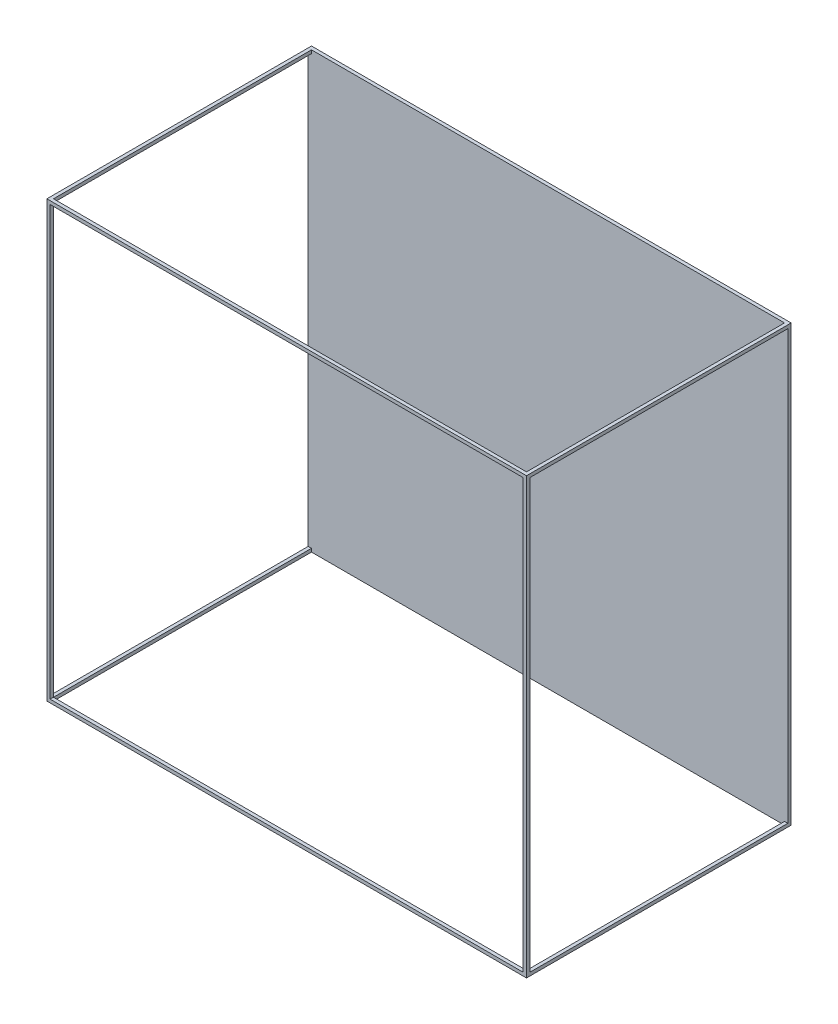
ISO-10303-21;
HEADER;
FILE_DESCRIPTION(('STEP AP214'),'2;1');
FILE_NAME('part.step','',(''),(''),'','','');
FILE_SCHEMA(('AUTOMOTIVE_DESIGN { 1 0 10303 214 1 1 1 1 }'));
ENDSEC;
DATA;
#1=APPLICATION_CONTEXT('core data for automotive mechanical design processes');
#2=APPLICATION_PROTOCOL_DEFINITION('international standard','automotive_design',2000,#1);
#3=PRODUCT_CONTEXT('',#1,'mechanical');
#4=PRODUCT('Part','Part','',(#3));
#5=PRODUCT_RELATED_PRODUCT_CATEGORY('part','',(#4));
#6=PRODUCT_DEFINITION_FORMATION('','',#4);
#7=PRODUCT_DEFINITION_CONTEXT('part definition',#1,'design');
#8=PRODUCT_DEFINITION('design','',#6,#7);
#9=PRODUCT_DEFINITION_SHAPE('','',#8);
#10=(LENGTH_UNIT() NAMED_UNIT(*) SI_UNIT(.MILLI.,.METRE.));
#11=(NAMED_UNIT(*) PLANE_ANGLE_UNIT() SI_UNIT($,.RADIAN.));
#12=(NAMED_UNIT(*) SI_UNIT($,.STERADIAN.) SOLID_ANGLE_UNIT());
#13=UNCERTAINTY_MEASURE_WITH_UNIT(LENGTH_MEASURE(1.E-05),#10,'distance_accuracy_value','');
#14=(GEOMETRIC_REPRESENTATION_CONTEXT(3) GLOBAL_UNCERTAINTY_ASSIGNED_CONTEXT((#13)) GLOBAL_UNIT_ASSIGNED_CONTEXT((#10,
#11,#12)) REPRESENTATION_CONTEXT('',''));
#15=CARTESIAN_POINT('',(0.,0.,0.));
#16=DIRECTION('',(0.,0.,1.));
#17=DIRECTION('',(1.,0.,0.));
#18=AXIS2_PLACEMENT_3D('',#15,#16,#17);
#19=CARTESIAN_POINT('',(-71.5,65.75,40.));
#20=DIRECTION('',(1.,0.,0.));
#21=DIRECTION('',(0.,1.,0.));
#22=AXIS2_PLACEMENT_3D('',#19,#20,#21);
#23=PLANE('',#22);
#24=DIRECTION('',(0.,0.,1.));
#25=VECTOR('',#24,1.);
#26=CARTESIAN_POINT('',(-71.5,64.75,40.));
#27=LINE('',#26,#25);
#28=CARTESIAN_POINT('',(-71.5,64.75,-39.));
#29=VERTEX_POINT('',#28);
#30=CARTESIAN_POINT('',(-71.5,64.75,39.));
#31=VERTEX_POINT('',#30);
#32=EDGE_CURVE('E202',#29,#31,#27,.T.);
#33=ORIENTED_EDGE('',*,*,#32,.F.);
#34=DIRECTION('',(0.,-1.,0.));
#35=VECTOR('',#34,1.);
#36=CARTESIAN_POINT('',(-71.5,65.75,-39.));
#37=LINE('',#36,#35);
#38=CARTESIAN_POINT('',(-71.5,65.75,-39.));
#39=VERTEX_POINT('',#38);
#40=EDGE_CURVE('E252',#39,#29,#37,.T.);
#41=ORIENTED_EDGE('',*,*,#40,.F.);
#42=DIRECTION('',(0.,0.,1.));
#43=VECTOR('',#42,1.);
#44=CARTESIAN_POINT('',(-71.5,65.75,-39.));
#45=LINE('',#44,#43);
#46=CARTESIAN_POINT('',(-71.5,65.75,39.));
#47=VERTEX_POINT('',#46);
#48=EDGE_CURVE('E218',#39,#47,#45,.T.);
#49=ORIENTED_EDGE('',*,*,#48,.T.);
#50=DIRECTION('',(0.,1.,0.));
#51=VECTOR('',#50,1.);
#52=CARTESIAN_POINT('',(-71.5,-94.25,39.));
#53=LINE('',#52,#51);
#54=EDGE_CURVE('E229',#31,#47,#53,.T.);
#55=ORIENTED_EDGE('',*,*,#54,.F.);
#56=EDGE_LOOP('',(#33,#41,#49,#55));
#57=FACE_BOUND('',#56,.T.);
#58=ADVANCED_FACE('F33',(#57),#23,.T.);
#59=DIRECTION('',(0.,-1.,0.));
#60=VECTOR('',#59,1.);
#61=CARTESIAN_POINT('',(-71.5,65.75,39.));
#62=LINE('',#61,#60);
#63=CARTESIAN_POINT('',(-71.5,-64.75,39.));
#64=VERTEX_POINT('',#63);
#65=EDGE_CURVE('E209',#31,#64,#62,.T.);
#66=ORIENTED_EDGE('',*,*,#65,.F.);
#67=DIRECTION('',(0.,0.,-1.));
#68=VECTOR('',#67,1.);
#69=CARTESIAN_POINT('',(-71.5,64.75,40.));
#70=LINE('',#69,#68);
#71=CARTESIAN_POINT('',(-71.5,64.75,40.));
#72=VERTEX_POINT('',#71);
#73=EDGE_CURVE('E261',#72,#31,#70,.T.);
#74=ORIENTED_EDGE('',*,*,#73,.F.);
#75=DIRECTION('',(0.,-1.,0.));
#76=VECTOR('',#75,1.);
#77=CARTESIAN_POINT('',(-71.5,65.75,40.));
#78=LINE('',#77,#76);
#79=CARTESIAN_POINT('',(-71.5,-64.75,40.));
#80=VERTEX_POINT('',#79);
#81=EDGE_CURVE('E269',#72,#80,#78,.T.);
#82=ORIENTED_EDGE('',*,*,#81,.T.);
#83=DIRECTION('',(0.,0.,-1.));
#84=VECTOR('',#83,1.);
#85=CARTESIAN_POINT('',(-71.5,-64.75,40.));
#86=LINE('',#85,#84);
#87=EDGE_CURVE('E256',#80,#64,#86,.T.);
#88=ORIENTED_EDGE('',*,*,#87,.T.);
#89=EDGE_LOOP('',(#66,#74,#82,#88));
#90=FACE_BOUND('',#89,.T.);
#91=ADVANCED_FACE('F338',(#90),#23,.T.);
#92=CARTESIAN_POINT('',(71.5,65.75,40.));
#93=DIRECTION('',(-1.,0.,0.));
#94=DIRECTION('',(0.,0.,1.));
#95=AXIS2_PLACEMENT_3D('',#92,#93,#94);
#96=PLANE('',#95);
#97=DIRECTION('',(0.,0.,-1.));
#98=VECTOR('',#97,1.);
#99=CARTESIAN_POINT('',(71.5,64.75,40.));
#100=LINE('',#99,#98);
#101=CARTESIAN_POINT('',(71.4999999999999,64.75,39.));
#102=VERTEX_POINT('',#101);
#103=CARTESIAN_POINT('',(71.5,64.75,-39.));
#104=VERTEX_POINT('',#103);
#105=EDGE_CURVE('E200',#102,#104,#100,.T.);
#106=ORIENTED_EDGE('',*,*,#105,.F.);
#107=DIRECTION('',(0.,1.,0.));
#108=VECTOR('',#107,1.);
#109=CARTESIAN_POINT('',(71.5,-94.25,39.));
#110=LINE('',#109,#108);
#111=CARTESIAN_POINT('',(71.5,65.75,39.));
#112=VERTEX_POINT('',#111);
#113=EDGE_CURVE('E230',#102,#112,#110,.T.);
#114=ORIENTED_EDGE('',*,*,#113,.T.);
#115=DIRECTION('',(0.,0.,-1.));
#116=VECTOR('',#115,1.);
#117=CARTESIAN_POINT('',(71.5,65.75,-39.));
#118=LINE('',#117,#116);
#119=CARTESIAN_POINT('',(71.5,65.75,-39.));
#120=VERTEX_POINT('',#119);
#121=EDGE_CURVE('E223',#112,#120,#118,.T.);
#122=ORIENTED_EDGE('',*,*,#121,.T.);
#123=DIRECTION('',(0.,1.,0.));
#124=VECTOR('',#123,1.);
#125=CARTESIAN_POINT('',(71.5,65.75,-39.));
#126=LINE('',#125,#124);
#127=EDGE_CURVE('E255',#104,#120,#126,.T.);
#128=ORIENTED_EDGE('',*,*,#127,.F.);
#129=EDGE_LOOP('',(#106,#114,#122,#128));
#130=FACE_BOUND('',#129,.T.);
#131=ADVANCED_FACE('F344',(#130),#96,.T.);
#132=DIRECTION('',(0.,1.,0.));
#133=VECTOR('',#132,1.);
#134=CARTESIAN_POINT('',(71.5,65.75,39.));
#135=LINE('',#134,#133);
#136=CARTESIAN_POINT('',(71.4999999999999,-64.75,39.));
#137=VERTEX_POINT('',#136);
#138=EDGE_CURVE('E207',#137,#102,#135,.T.);
#139=ORIENTED_EDGE('',*,*,#138,.F.);
#140=DIRECTION('',(0.,0.,-1.));
#141=VECTOR('',#140,1.);
#142=CARTESIAN_POINT('',(71.5,-64.75,40.));
#143=LINE('',#142,#141);
#144=CARTESIAN_POINT('',(71.5,-64.75,40.));
#145=VERTEX_POINT('',#144);
#146=EDGE_CURVE('E260',#145,#137,#143,.T.);
#147=ORIENTED_EDGE('',*,*,#146,.F.);
#148=DIRECTION('',(0.,1.,0.));
#149=VECTOR('',#148,1.);
#150=CARTESIAN_POINT('',(71.5,65.75,40.));
#151=LINE('',#150,#149);
#152=CARTESIAN_POINT('',(71.5,64.75,40.));
#153=VERTEX_POINT('',#152);
#154=EDGE_CURVE('E275',#145,#153,#151,.T.);
#155=ORIENTED_EDGE('',*,*,#154,.T.);
#156=DIRECTION('',(0.,0.,-1.));
#157=VECTOR('',#156,1.);
#158=CARTESIAN_POINT('',(71.5,64.75,40.));
#159=LINE('',#158,#157);
#160=EDGE_CURVE('E264',#153,#102,#159,.T.);
#161=ORIENTED_EDGE('',*,*,#160,.T.);
#162=EDGE_LOOP('',(#139,#147,#155,#161));
#163=FACE_BOUND('',#162,.T.);
#164=ADVANCED_FACE('F375',(#163),#96,.T.);
#165=CARTESIAN_POINT('',(-72.5,65.75,40.));
#166=DIRECTION('',(1.,0.,0.));
#167=DIRECTION('',(0.,1.,0.));
#168=AXIS2_PLACEMENT_3D('',#165,#166,#167);
#169=PLANE('',#168);
#170=DIRECTION('',(0.,0.,1.));
#171=VECTOR('',#170,1.);
#172=CARTESIAN_POINT('',(-72.5,64.75,40.));
#173=LINE('',#172,#171);
#174=CARTESIAN_POINT('',(-72.5,64.75,-39.));
#175=VERTEX_POINT('',#174);
#176=CARTESIAN_POINT('',(-72.5,64.75,39.));
#177=VERTEX_POINT('',#176);
#178=EDGE_CURVE('E204',#175,#177,#173,.T.);
#179=ORIENTED_EDGE('',*,*,#178,.T.);
#180=DIRECTION('',(0.,-1.,0.));
#181=VECTOR('',#180,1.);
#182=CARTESIAN_POINT('',(-72.5,65.75,39.));
#183=LINE('',#182,#181);
#184=CARTESIAN_POINT('',(-72.5,-64.75,39.));
#185=VERTEX_POINT('',#184);
#186=EDGE_CURVE('E212',#177,#185,#183,.T.);
#187=ORIENTED_EDGE('',*,*,#186,.T.);
#188=DIRECTION('',(0.,0.,-1.));
#189=VECTOR('',#188,1.);
#190=CARTESIAN_POINT('',(-72.5,-64.75,40.));
#191=LINE('',#190,#189);
#192=CARTESIAN_POINT('',(-72.5,-64.75,-39.));
#193=VERTEX_POINT('',#192);
#194=EDGE_CURVE('E197',#185,#193,#191,.T.);
#195=ORIENTED_EDGE('',*,*,#194,.T.);
#196=DIRECTION('',(0.,1.,0.));
#197=VECTOR('',#196,1.);
#198=CARTESIAN_POINT('',(-72.5,65.75,-39.));
#199=LINE('',#198,#197);
#200=EDGE_CURVE('E215',#193,#175,#199,.T.);
#201=ORIENTED_EDGE('',*,*,#200,.T.);
#202=EDGE_LOOP('',(#179,#187,#195,#201));
#203=FACE_BOUND('',#202,.T.);
#204=DIRECTION('',(0.,-1.,0.));
#205=VECTOR('',#204,1.);
#206=CARTESIAN_POINT('',(-72.5,65.75,-40.));
#207=LINE('',#206,#205);
#208=CARTESIAN_POINT('',(-72.5,65.75,-40.));
#209=VERTEX_POINT('',#208);
#210=CARTESIAN_POINT('',(-72.5,-65.75,-40.));
#211=VERTEX_POINT('',#210);
#212=EDGE_CURVE('E259',#209,#211,#207,.T.);
#213=ORIENTED_EDGE('',*,*,#212,.T.);
#214=DIRECTION('',(0.,0.,-1.));
#215=VECTOR('',#214,1.);
#216=CARTESIAN_POINT('',(-72.5,-65.75,40.));
#217=LINE('',#216,#215);
#218=CARTESIAN_POINT('',(-72.5,-65.75,40.));
#219=VERTEX_POINT('',#218);
#220=EDGE_CURVE('E41',#219,#211,#217,.T.);
#221=ORIENTED_EDGE('',*,*,#220,.F.);
#222=DIRECTION('',(0.,-1.,0.));
#223=VECTOR('',#222,1.);
#224=CARTESIAN_POINT('',(-72.5,65.75,40.));
#225=LINE('',#224,#223);
#226=CARTESIAN_POINT('',(-72.5,65.75,40.));
#227=VERTEX_POINT('',#226);
#228=EDGE_CURVE('E279',#227,#219,#225,.T.);
#229=ORIENTED_EDGE('',*,*,#228,.F.);
#230=DIRECTION('',(0.,0.,-1.));
#231=VECTOR('',#230,1.);
#232=CARTESIAN_POINT('',(-72.5,65.75,40.));
#233=LINE('',#232,#231);
#234=EDGE_CURVE('E289',#227,#209,#233,.T.);
#235=ORIENTED_EDGE('',*,*,#234,.T.);
#236=EDGE_LOOP('',(#213,#221,#229,#235));
#237=FACE_BOUND('',#236,.T.);
#238=ADVANCED_FACE('F35',(#203,#237),#169,.F.);
#239=CARTESIAN_POINT('',(-72.5,-65.75,40.));
#240=DIRECTION('',(0.,1.,0.));
#241=DIRECTION('',(-1.,0.,0.));
#242=AXIS2_PLACEMENT_3D('',#239,#240,#241);
#243=PLANE('',#242);
#244=DIRECTION('',(-1.,0.,0.));
#245=VECTOR('',#244,1.);
#246=CARTESIAN_POINT('',(-72.5,-65.75,-39.));
#247=LINE('',#246,#245);
#248=CARTESIAN_POINT('',(71.5,-65.75,-39.));
#249=VERTEX_POINT('',#248);
#250=CARTESIAN_POINT('',(-71.5,-65.75,-39.));
#251=VERTEX_POINT('',#250);
#252=EDGE_CURVE('E248',#249,#251,#247,.T.);
#253=ORIENTED_EDGE('',*,*,#252,.T.);
#254=DIRECTION('',(0.,0.,1.));
#255=VECTOR('',#254,1.);
#256=CARTESIAN_POINT('',(-71.5,-65.75,40.));
#257=LINE('',#256,#255);
#258=CARTESIAN_POINT('',(-71.5,-65.75,39.));
#259=VERTEX_POINT('',#258);
#260=EDGE_CURVE('E239',#251,#259,#257,.T.);
#261=ORIENTED_EDGE('',*,*,#260,.T.);
#262=DIRECTION('',(1.,0.,0.));
#263=VECTOR('',#262,1.);
#264=CARTESIAN_POINT('',(-72.5,-65.75,39.));
#265=LINE('',#264,#263);
#266=CARTESIAN_POINT('',(71.5,-65.75,39.));
#267=VERTEX_POINT('',#266);
#268=EDGE_CURVE('E245',#259,#267,#265,.T.);
#269=ORIENTED_EDGE('',*,*,#268,.T.);
#270=DIRECTION('',(0.,0.,-1.));
#271=VECTOR('',#270,1.);
#272=CARTESIAN_POINT('',(71.5,-65.75,40.));
#273=LINE('',#272,#271);
#274=EDGE_CURVE('E236',#267,#249,#273,.T.);
#275=ORIENTED_EDGE('',*,*,#274,.T.);
#276=EDGE_LOOP('',(#253,#261,#269,#275));
#277=FACE_BOUND('',#276,.T.);
#278=DIRECTION('',(1.,0.,0.));
#279=VECTOR('',#278,1.);
#280=CARTESIAN_POINT('',(-72.5,-65.75,-40.));
#281=LINE('',#280,#279);
#282=CARTESIAN_POINT('',(72.5,-65.75,-40.));
#283=VERTEX_POINT('',#282);
#284=EDGE_CURVE('E292',#211,#283,#281,.T.);
#285=ORIENTED_EDGE('',*,*,#284,.T.);
#286=DIRECTION('',(0.,0.,-1.));
#287=VECTOR('',#286,1.);
#288=CARTESIAN_POINT('',(72.5,-65.75,40.));
#289=LINE('',#288,#287);
#290=CARTESIAN_POINT('',(72.5,-65.75,40.));
#291=VERTEX_POINT('',#290);
#292=EDGE_CURVE('E302',#291,#283,#289,.T.);
#293=ORIENTED_EDGE('',*,*,#292,.F.);
#294=DIRECTION('',(1.,0.,0.));
#295=VECTOR('',#294,1.);
#296=CARTESIAN_POINT('',(-72.5,-65.75,40.));
#297=LINE('',#296,#295);
#298=EDGE_CURVE('E282',#219,#291,#297,.T.);
#299=ORIENTED_EDGE('',*,*,#298,.F.);
#300=ORIENTED_EDGE('',*,*,#220,.T.);
#301=EDGE_LOOP('',(#285,#293,#299,#300));
#302=FACE_BOUND('',#301,.T.);
#303=ADVANCED_FACE('F307',(#277,#302),#243,.F.);
#304=CARTESIAN_POINT('',(72.5,65.75,40.));
#305=DIRECTION('',(-1.,0.,0.));
#306=DIRECTION('',(0.,0.,1.));
#307=AXIS2_PLACEMENT_3D('',#304,#305,#306);
#308=PLANE('',#307);
#309=DIRECTION('',(0.,0.,-1.));
#310=VECTOR('',#309,1.);
#311=CARTESIAN_POINT('',(72.5,-64.75,39.));
#312=LINE('',#311,#310);
#313=CARTESIAN_POINT('',(72.5,-64.75,39.));
#314=VERTEX_POINT('',#313);
#315=CARTESIAN_POINT('',(72.5,-64.75,-39.));
#316=VERTEX_POINT('',#315);
#317=EDGE_CURVE('E173',#314,#316,#312,.T.);
#318=ORIENTED_EDGE('',*,*,#317,.F.);
#319=DIRECTION('',(0.,-1.,0.));
#320=VECTOR('',#319,1.);
#321=CARTESIAN_POINT('',(72.5,64.75,39.));
#322=LINE('',#321,#320);
#323=CARTESIAN_POINT('',(72.5,64.75,39.));
#324=VERTEX_POINT('',#323);
#325=EDGE_CURVE('E56',#324,#314,#322,.T.);
#326=ORIENTED_EDGE('',*,*,#325,.F.);
#327=DIRECTION('',(0.,0.,1.));
#328=VECTOR('',#327,1.);
#329=CARTESIAN_POINT('',(72.5,64.75,39.));
#330=LINE('',#329,#328);
#331=CARTESIAN_POINT('',(72.5,64.75,-39.));
#332=VERTEX_POINT('',#331);
#333=EDGE_CURVE('E181',#332,#324,#330,.T.);
#334=ORIENTED_EDGE('',*,*,#333,.F.);
#335=DIRECTION('',(0.,1.,0.));
#336=VECTOR('',#335,1.);
#337=CARTESIAN_POINT('',(72.5,64.75,-39.));
#338=LINE('',#337,#336);
#339=EDGE_CURVE('E164',#316,#332,#338,.T.);
#340=ORIENTED_EDGE('',*,*,#339,.F.);
#341=EDGE_LOOP('',(#318,#326,#334,#340));
#342=FACE_BOUND('',#341,.T.);
#343=DIRECTION('',(0.,1.,0.));
#344=VECTOR('',#343,1.);
#345=CARTESIAN_POINT('',(72.5,65.75,-40.));
#346=LINE('',#345,#344);
#347=CARTESIAN_POINT('',(72.5,65.75,-40.));
#348=VERTEX_POINT('',#347);
#349=EDGE_CURVE('E294',#283,#348,#346,.T.);
#350=ORIENTED_EDGE('',*,*,#349,.T.);
#351=DIRECTION('',(0.,0.,-1.));
#352=VECTOR('',#351,1.);
#353=CARTESIAN_POINT('',(72.5,65.75,40.));
#354=LINE('',#353,#352);
#355=CARTESIAN_POINT('',(72.5,65.75,40.));
#356=VERTEX_POINT('',#355);
#357=EDGE_CURVE('E299',#356,#348,#354,.T.);
#358=ORIENTED_EDGE('',*,*,#357,.F.);
#359=DIRECTION('',(0.,1.,0.));
#360=VECTOR('',#359,1.);
#361=CARTESIAN_POINT('',(72.5,65.75,40.));
#362=LINE('',#361,#360);
#363=EDGE_CURVE('E285',#291,#356,#362,.T.);
#364=ORIENTED_EDGE('',*,*,#363,.F.);
#365=ORIENTED_EDGE('',*,*,#292,.T.);
#366=EDGE_LOOP('',(#350,#358,#364,#365));
#367=FACE_BOUND('',#366,.T.);
#368=ADVANCED_FACE('F178',(#342,#367),#308,.F.);
#369=CARTESIAN_POINT('',(-72.5,65.75,40.));
#370=DIRECTION('',(0.,-1.,0.));
#371=DIRECTION('',(1.,0.,0.));
#372=AXIS2_PLACEMENT_3D('',#369,#370,#371);
#373=PLANE('',#372);
#374=DIRECTION('',(1.,0.,0.));
#375=VECTOR('',#374,1.);
#376=CARTESIAN_POINT('',(-71.5,65.75,39.));
#377=LINE('',#376,#375);
#378=EDGE_CURVE('E220',#47,#112,#377,.T.);
#379=ORIENTED_EDGE('',*,*,#378,.F.);
#380=ORIENTED_EDGE('',*,*,#48,.F.);
#381=DIRECTION('',(-1.,0.,0.));
#382=VECTOR('',#381,1.);
#383=CARTESIAN_POINT('',(-71.5,65.75,-39.));
#384=LINE('',#383,#382);
#385=EDGE_CURVE('E226',#120,#39,#384,.T.);
#386=ORIENTED_EDGE('',*,*,#385,.F.);
#387=ORIENTED_EDGE('',*,*,#121,.F.);
#388=EDGE_LOOP('',(#379,#380,#386,#387));
#389=FACE_BOUND('',#388,.T.);
#390=DIRECTION('',(-1.,0.,0.));
#391=VECTOR('',#390,1.);
#392=CARTESIAN_POINT('',(-72.5,65.75,-40.));
#393=LINE('',#392,#391);
#394=EDGE_CURVE('E283',#348,#209,#393,.T.);
#395=ORIENTED_EDGE('',*,*,#394,.T.);
#396=ORIENTED_EDGE('',*,*,#234,.F.);
#397=DIRECTION('',(-1.,0.,0.));
#398=VECTOR('',#397,1.);
#399=CARTESIAN_POINT('',(-72.5,65.75,40.));
#400=LINE('',#399,#398);
#401=EDGE_CURVE('E287',#356,#227,#400,.T.);
#402=ORIENTED_EDGE('',*,*,#401,.F.);
#403=ORIENTED_EDGE('',*,*,#357,.T.);
#404=EDGE_LOOP('',(#395,#396,#402,#403));
#405=FACE_BOUND('',#404,.T.);
#406=ADVANCED_FACE('F321',(#389,#405),#373,.F.);
#407=CARTESIAN_POINT('',(0.,0.,40.));
#408=DIRECTION('',(0.,0.,1.));
#409=DIRECTION('',(1.,0.,0.));
#410=AXIS2_PLACEMENT_3D('',#407,#408,#409);
#411=PLANE('',#410);
#412=ORIENTED_EDGE('',*,*,#81,.F.);
#413=DIRECTION('',(-1.,0.,0.));
#414=VECTOR('',#413,1.);
#415=CARTESIAN_POINT('',(-72.5,64.75,40.));
#416=LINE('',#415,#414);
#417=EDGE_CURVE('E265',#153,#72,#416,.T.);
#418=ORIENTED_EDGE('',*,*,#417,.F.);
#419=ORIENTED_EDGE('',*,*,#154,.F.);
#420=DIRECTION('',(1.,0.,0.));
#421=VECTOR('',#420,1.);
#422=CARTESIAN_POINT('',(-72.5,-64.75,40.));
#423=LINE('',#422,#421);
#424=EDGE_CURVE('E273',#80,#145,#423,.T.);
#425=ORIENTED_EDGE('',*,*,#424,.F.);
#426=EDGE_LOOP('',(#412,#418,#419,#425));
#427=FACE_BOUND('',#426,.T.);
#428=ORIENTED_EDGE('',*,*,#228,.T.);
#429=ORIENTED_EDGE('',*,*,#298,.T.);
#430=ORIENTED_EDGE('',*,*,#363,.T.);
#431=ORIENTED_EDGE('',*,*,#401,.T.);
#432=EDGE_LOOP('',(#428,#429,#430,#431));
#433=FACE_BOUND('',#432,.T.);
#434=ADVANCED_FACE('F323',(#427,#433),#411,.T.);
#435=CARTESIAN_POINT('',(0.,0.,-40.));
#436=DIRECTION('',(0.,0.,1.));
#437=DIRECTION('',(1.,0.,0.));
#438=AXIS2_PLACEMENT_3D('',#435,#436,#437);
#439=PLANE('',#438);
#440=ORIENTED_EDGE('',*,*,#212,.F.);
#441=ORIENTED_EDGE('',*,*,#394,.F.);
#442=ORIENTED_EDGE('',*,*,#349,.F.);
#443=ORIENTED_EDGE('',*,*,#284,.F.);
#444=EDGE_LOOP('',(#440,#441,#442,#443));
#445=FACE_BOUND('',#444,.T.);
#446=ADVANCED_FACE('F315',(#445),#439,.F.);
#447=DIRECTION('',(0.,0.,-1.));
#448=VECTOR('',#447,1.);
#449=CARTESIAN_POINT('',(-71.5,-64.75,40.));
#450=LINE('',#449,#448);
#451=CARTESIAN_POINT('',(-71.5,-64.75,-39.));
#452=VERTEX_POINT('',#451);
#453=EDGE_CURVE('E195',#64,#452,#450,.T.);
#454=ORIENTED_EDGE('',*,*,#453,.F.);
#455=EDGE_CURVE('E233',#259,#64,#53,.T.);
#456=ORIENTED_EDGE('',*,*,#455,.F.);
#457=ORIENTED_EDGE('',*,*,#260,.F.);
#458=EDGE_CURVE('E251',#452,#251,#37,.T.);
#459=ORIENTED_EDGE('',*,*,#458,.F.);
#460=EDGE_LOOP('',(#454,#456,#457,#459));
#461=FACE_BOUND('',#460,.T.);
#462=ADVANCED_FACE('F331',(#461),#23,.T.);
#463=CARTESIAN_POINT('',(-72.5,-64.75,40.));
#464=DIRECTION('',(0.,1.,0.));
#465=DIRECTION('',(-1.,0.,0.));
#466=AXIS2_PLACEMENT_3D('',#463,#464,#465);
#467=PLANE('',#466);
#468=DIRECTION('',(1.,0.,0.));
#469=VECTOR('',#468,1.);
#470=CARTESIAN_POINT('',(-72.5,-64.75,39.));
#471=LINE('',#470,#469);
#472=EDGE_CURVE('E242',#64,#137,#471,.T.);
#473=ORIENTED_EDGE('',*,*,#472,.F.);
#474=ORIENTED_EDGE('',*,*,#87,.F.);
#475=ORIENTED_EDGE('',*,*,#424,.T.);
#476=ORIENTED_EDGE('',*,*,#146,.T.);
#477=EDGE_LOOP('',(#473,#474,#475,#476));
#478=FACE_BOUND('',#477,.T.);
#479=ADVANCED_FACE('F350',(#478),#467,.T.);
#480=DIRECTION('',(0.,0.,1.));
#481=VECTOR('',#480,1.);
#482=CARTESIAN_POINT('',(71.5,-64.75,40.));
#483=LINE('',#482,#481);
#484=CARTESIAN_POINT('',(71.5,-64.75,-39.));
#485=VERTEX_POINT('',#484);
#486=EDGE_CURVE('E193',#485,#137,#483,.T.);
#487=ORIENTED_EDGE('',*,*,#486,.F.);
#488=EDGE_CURVE('E167',#249,#485,#126,.T.);
#489=ORIENTED_EDGE('',*,*,#488,.F.);
#490=ORIENTED_EDGE('',*,*,#274,.F.);
#491=EDGE_CURVE('E232',#267,#137,#110,.T.);
#492=ORIENTED_EDGE('',*,*,#491,.T.);
#493=EDGE_LOOP('',(#487,#489,#490,#492));
#494=FACE_BOUND('',#493,.T.);
#495=ADVANCED_FACE('F355',(#494),#96,.T.);
#496=CARTESIAN_POINT('',(-72.5,64.75,40.));
#497=DIRECTION('',(0.,-1.,0.));
#498=DIRECTION('',(1.,0.,0.));
#499=AXIS2_PLACEMENT_3D('',#496,#497,#498);
#500=PLANE('',#499);
#501=DIRECTION('',(-1.,0.,0.));
#502=VECTOR('',#501,1.);
#503=CARTESIAN_POINT('',(-72.5,64.75,39.));
#504=LINE('',#503,#502);
#505=EDGE_CURVE('E11',#102,#31,#504,.T.);
#506=ORIENTED_EDGE('',*,*,#505,.F.);
#507=ORIENTED_EDGE('',*,*,#160,.F.);
#508=ORIENTED_EDGE('',*,*,#417,.T.);
#509=ORIENTED_EDGE('',*,*,#73,.T.);
#510=EDGE_LOOP('',(#506,#507,#508,#509));
#511=FACE_BOUND('',#510,.T.);
#512=ADVANCED_FACE('F391',(#511),#500,.T.);
#513=CARTESIAN_POINT('',(0.,0.,-39.));
#514=DIRECTION('',(0.,0.,1.));
#515=DIRECTION('',(1.,0.,0.));
#516=AXIS2_PLACEMENT_3D('',#513,#514,#515);
#517=PLANE('',#516);
#518=ORIENTED_EDGE('',*,*,#488,.T.);
#519=DIRECTION('',(1.,0.,0.));
#520=VECTOR('',#519,1.);
#521=CARTESIAN_POINT('',(-107.5,-64.75,-39.));
#522=LINE('',#521,#520);
#523=EDGE_CURVE('E159',#485,#316,#522,.T.);
#524=ORIENTED_EDGE('',*,*,#523,.T.);
#525=ORIENTED_EDGE('',*,*,#339,.T.);
#526=DIRECTION('',(1.,0.,0.));
#527=VECTOR('',#526,1.);
#528=CARTESIAN_POINT('',(-107.5,64.75,-39.));
#529=LINE('',#528,#527);
#530=EDGE_CURVE('E190',#104,#332,#529,.T.);
#531=ORIENTED_EDGE('',*,*,#530,.F.);
#532=ORIENTED_EDGE('',*,*,#127,.T.);
#533=ORIENTED_EDGE('',*,*,#385,.T.);
#534=ORIENTED_EDGE('',*,*,#40,.T.);
#535=EDGE_CURVE('E189',#175,#29,#529,.T.);
#536=ORIENTED_EDGE('',*,*,#535,.F.);
#537=ORIENTED_EDGE('',*,*,#200,.F.);
#538=EDGE_CURVE('E48',#193,#452,#522,.T.);
#539=ORIENTED_EDGE('',*,*,#538,.T.);
#540=ORIENTED_EDGE('',*,*,#458,.T.);
#541=ORIENTED_EDGE('',*,*,#252,.F.);
#542=EDGE_LOOP('',(#518,#524,#525,#531,#532,#533,#534,#536,#537,#539,#540,#541));
#543=FACE_BOUND('',#542,.T.);
#544=ADVANCED_FACE('F161',(#543),#517,.T.);
#545=CARTESIAN_POINT('',(-71.5,-94.25,39.));
#546=DIRECTION('',(0.,0.,1.));
#547=DIRECTION('',(1.,0.,0.));
#548=AXIS2_PLACEMENT_3D('',#545,#546,#547);
#549=PLANE('',#548);
#550=ORIENTED_EDGE('',*,*,#505,.T.);
#551=ORIENTED_EDGE('',*,*,#54,.T.);
#552=ORIENTED_EDGE('',*,*,#378,.T.);
#553=ORIENTED_EDGE('',*,*,#113,.F.);
#554=EDGE_LOOP('',(#550,#551,#552,#553));
#555=FACE_BOUND('',#554,.T.);
#556=ADVANCED_FACE('F386',(#555),#549,.F.);
#557=ORIENTED_EDGE('',*,*,#455,.T.);
#558=ORIENTED_EDGE('',*,*,#472,.T.);
#559=ORIENTED_EDGE('',*,*,#491,.F.);
#560=ORIENTED_EDGE('',*,*,#268,.F.);
#561=EDGE_LOOP('',(#557,#558,#559,#560));
#562=FACE_BOUND('',#561,.T.);
#563=ADVANCED_FACE('F364',(#562),#549,.F.);
#564=CARTESIAN_POINT('',(-107.5,-64.75,39.));
#565=DIRECTION('',(0.,-1.,0.));
#566=DIRECTION('',(0.,0.,-1.));
#567=AXIS2_PLACEMENT_3D('',#564,#565,#566);
#568=PLANE('',#567);
#569=ORIENTED_EDGE('',*,*,#486,.T.);
#570=DIRECTION('',(1.,0.,0.));
#571=VECTOR('',#570,1.);
#572=CARTESIAN_POINT('',(-107.5,-64.75,39.));
#573=LINE('',#572,#571);
#574=EDGE_CURVE('E175',#137,#314,#573,.T.);
#575=ORIENTED_EDGE('',*,*,#574,.T.);
#576=ORIENTED_EDGE('',*,*,#317,.T.);
#577=ORIENTED_EDGE('',*,*,#523,.F.);
#578=EDGE_LOOP('',(#569,#575,#576,#577));
#579=FACE_BOUND('',#578,.T.);
#580=ADVANCED_FACE('F174',(#579),#568,.F.);
#581=CARTESIAN_POINT('',(-107.5,64.75,39.));
#582=DIRECTION('',(0.,1.,0.));
#583=DIRECTION('',(0.,0.,1.));
#584=AXIS2_PLACEMENT_3D('',#581,#582,#583);
#585=PLANE('',#584);
#586=ORIENTED_EDGE('',*,*,#105,.T.);
#587=ORIENTED_EDGE('',*,*,#530,.T.);
#588=ORIENTED_EDGE('',*,*,#333,.T.);
#589=DIRECTION('',(1.,0.,0.));
#590=VECTOR('',#589,1.);
#591=CARTESIAN_POINT('',(-107.5,64.75,39.));
#592=LINE('',#591,#590);
#593=EDGE_CURVE('E186',#102,#324,#592,.T.);
#594=ORIENTED_EDGE('',*,*,#593,.F.);
#595=EDGE_LOOP('',(#586,#587,#588,#594));
#596=FACE_BOUND('',#595,.T.);
#597=ADVANCED_FACE('F380',(#596),#585,.F.);
#598=CARTESIAN_POINT('',(-107.5,64.75,39.));
#599=DIRECTION('',(0.,0.,1.));
#600=DIRECTION('',(0.,-1.,0.));
#601=AXIS2_PLACEMENT_3D('',#598,#599,#600);
#602=PLANE('',#601);
#603=ORIENTED_EDGE('',*,*,#138,.T.);
#604=ORIENTED_EDGE('',*,*,#593,.T.);
#605=ORIENTED_EDGE('',*,*,#325,.T.);
#606=ORIENTED_EDGE('',*,*,#574,.F.);
#607=EDGE_LOOP('',(#603,#604,#605,#606));
#608=FACE_BOUND('',#607,.T.);
#609=ADVANCED_FACE('F377',(#608),#602,.F.);
#610=EDGE_CURVE('E188',#177,#31,#592,.T.);
#611=ORIENTED_EDGE('',*,*,#610,.T.);
#612=ORIENTED_EDGE('',*,*,#65,.T.);
#613=EDGE_CURVE('E170',#185,#64,#573,.T.);
#614=ORIENTED_EDGE('',*,*,#613,.F.);
#615=ORIENTED_EDGE('',*,*,#186,.F.);
#616=EDGE_LOOP('',(#611,#612,#614,#615));
#617=FACE_BOUND('',#616,.T.);
#618=ADVANCED_FACE('F420',(#617),#602,.F.);
#619=ORIENTED_EDGE('',*,*,#535,.T.);
#620=ORIENTED_EDGE('',*,*,#32,.T.);
#621=ORIENTED_EDGE('',*,*,#610,.F.);
#622=ORIENTED_EDGE('',*,*,#178,.F.);
#623=EDGE_LOOP('',(#619,#620,#621,#622));
#624=FACE_BOUND('',#623,.T.);
#625=ADVANCED_FACE('F415',(#624),#585,.F.);
#626=ORIENTED_EDGE('',*,*,#613,.T.);
#627=ORIENTED_EDGE('',*,*,#453,.T.);
#628=ORIENTED_EDGE('',*,*,#538,.F.);
#629=ORIENTED_EDGE('',*,*,#194,.F.);
#630=EDGE_LOOP('',(#626,#627,#628,#629));
#631=FACE_BOUND('',#630,.T.);
#632=ADVANCED_FACE('F422',(#631),#568,.F.);
#633=CLOSED_SHELL('',(#58,#91,#131,#164,#238,#303,#368,#406,#434,#446,#462,#479,#495,#512,#544,
#556,#563,#580,#597,#609,#618,#625,#632));
#634=MANIFOLD_SOLID_BREP('B2',#633);
#635=ADVANCED_BREP_SHAPE_REPRESENTATION('',(#18,#634),#14);
#636=SHAPE_DEFINITION_REPRESENTATION(#9,#635);
ENDSEC;
END-ISO-10303-21;
